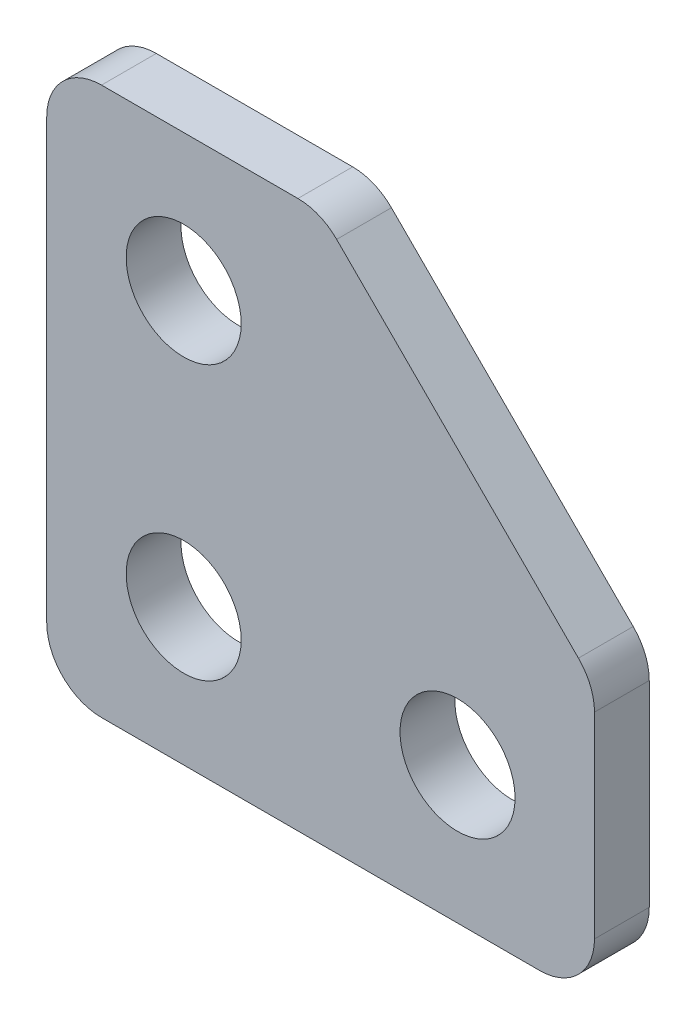
ISO-10303-21;
HEADER;
FILE_DESCRIPTION(('STEP AP214'),'2;1');
FILE_NAME('part.step','',(''),(''),'','','');
FILE_SCHEMA(('AUTOMOTIVE_DESIGN { 1 0 10303 214 1 1 1 1 }'));
ENDSEC;
DATA;
#1=APPLICATION_CONTEXT('core data for automotive mechanical design processes');
#2=APPLICATION_PROTOCOL_DEFINITION('international standard','automotive_design',2000,#1);
#3=PRODUCT_CONTEXT('',#1,'mechanical');
#4=PRODUCT('Part','Part','',(#3));
#5=PRODUCT_RELATED_PRODUCT_CATEGORY('part','',(#4));
#6=PRODUCT_DEFINITION_FORMATION('','',#4);
#7=PRODUCT_DEFINITION_CONTEXT('part definition',#1,'design');
#8=PRODUCT_DEFINITION('design','',#6,#7);
#9=PRODUCT_DEFINITION_SHAPE('','',#8);
#10=(LENGTH_UNIT() NAMED_UNIT(*) SI_UNIT(.MILLI.,.METRE.));
#11=(NAMED_UNIT(*) PLANE_ANGLE_UNIT() SI_UNIT($,.RADIAN.));
#12=(NAMED_UNIT(*) SI_UNIT($,.STERADIAN.) SOLID_ANGLE_UNIT());
#13=UNCERTAINTY_MEASURE_WITH_UNIT(LENGTH_MEASURE(1.E-05),#10,'distance_accuracy_value','');
#14=(GEOMETRIC_REPRESENTATION_CONTEXT(3) GLOBAL_UNCERTAINTY_ASSIGNED_CONTEXT((#13)) GLOBAL_UNIT_ASSIGNED_CONTEXT((#10,
#11,#12)) REPRESENTATION_CONTEXT('',''));
#15=CARTESIAN_POINT('',(0.,0.,0.));
#16=DIRECTION('',(0.,0.,1.));
#17=DIRECTION('',(1.,0.,0.));
#18=AXIS2_PLACEMENT_3D('',#15,#16,#17);
#19=CARTESIAN_POINT('',(0.,-5.,2.));
#20=DIRECTION('',(0.,1.,0.));
#21=DIRECTION('',(0.,0.,1.));
#22=AXIS2_PLACEMENT_3D('',#19,#20,#21);
#23=PLANE('',#22);
#24=DIRECTION('',(1.,0.,0.));
#25=VECTOR('',#24,1.);
#26=CARTESIAN_POINT('',(0.,-5.,2.));
#27=LINE('',#26,#25);
#28=CARTESIAN_POINT('',(-3.,-5.,2.));
#29=VERTEX_POINT('',#28);
#30=CARTESIAN_POINT('',(13.,-5.,2.));
#31=VERTEX_POINT('',#30);
#32=EDGE_CURVE('E136',#29,#31,#27,.T.);
#33=ORIENTED_EDGE('',*,*,#32,.F.);
#34=DIRECTION('',(0.,0.,-1.));
#35=VECTOR('',#34,1.);
#36=CARTESIAN_POINT('',(-3.,-5.,2.));
#37=LINE('',#36,#35);
#38=CARTESIAN_POINT('',(-3.,-5.,0.));
#39=VERTEX_POINT('',#38);
#40=EDGE_CURVE('E121',#29,#39,#37,.T.);
#41=ORIENTED_EDGE('',*,*,#40,.T.);
#42=DIRECTION('',(1.,0.,0.));
#43=VECTOR('',#42,1.);
#44=CARTESIAN_POINT('',(0.,-5.,0.));
#45=LINE('',#44,#43);
#46=CARTESIAN_POINT('',(13.,-5.,0.));
#47=VERTEX_POINT('',#46);
#48=EDGE_CURVE('E133',#39,#47,#45,.T.);
#49=ORIENTED_EDGE('',*,*,#48,.T.);
#50=DIRECTION('',(0.,0.,-1.));
#51=VECTOR('',#50,1.);
#52=CARTESIAN_POINT('',(13.,-5.,2.));
#53=LINE('',#52,#51);
#54=EDGE_CURVE('E138',#47,#31,#53,.F.);
#55=ORIENTED_EDGE('',*,*,#54,.T.);
#56=EDGE_LOOP('',(#33,#41,#49,#55));
#57=FACE_BOUND('',#56,.T.);
#58=ADVANCED_FACE('F39',(#57),#23,.F.);
#59=CARTESIAN_POINT('',(15.,0.,2.));
#60=DIRECTION('',(1.,0.,0.));
#61=DIRECTION('',(0.,0.,-1.));
#62=AXIS2_PLACEMENT_3D('',#59,#60,#61);
#63=PLANE('',#62);
#64=DIRECTION('',(0.,-1.,0.));
#65=VECTOR('',#64,1.);
#66=CARTESIAN_POINT('',(15.,0.,2.));
#67=LINE('',#66,#65);
#68=CARTESIAN_POINT('',(15.,4.17157287525381,2.));
#69=VERTEX_POINT('',#68);
#70=CARTESIAN_POINT('',(15.,-3.,2.));
#71=VERTEX_POINT('',#70);
#72=EDGE_CURVE('E266',#69,#71,#67,.T.);
#73=ORIENTED_EDGE('',*,*,#72,.T.);
#74=DIRECTION('',(0.,0.,-1.));
#75=VECTOR('',#74,1.);
#76=CARTESIAN_POINT('',(15.,-3.,0.));
#77=LINE('',#76,#75);
#78=CARTESIAN_POINT('',(15.,-3.,0.));
#79=VERTEX_POINT('',#78);
#80=EDGE_CURVE('E275',#71,#79,#77,.T.);
#81=ORIENTED_EDGE('',*,*,#80,.T.);
#82=DIRECTION('',(0.,-1.,0.));
#83=VECTOR('',#82,1.);
#84=CARTESIAN_POINT('',(15.,0.,0.));
#85=LINE('',#84,#83);
#86=CARTESIAN_POINT('',(15.,4.17157287525381,0.));
#87=VERTEX_POINT('',#86);
#88=EDGE_CURVE('E143',#87,#79,#85,.T.);
#89=ORIENTED_EDGE('',*,*,#88,.F.);
#90=DIRECTION('',(0.,0.,-1.));
#91=VECTOR('',#90,1.);
#92=CARTESIAN_POINT('',(15.,4.17157287525381,2.));
#93=LINE('',#92,#91);
#94=EDGE_CURVE('E274',#87,#69,#93,.F.);
#95=ORIENTED_EDGE('',*,*,#94,.T.);
#96=EDGE_LOOP('',(#73,#81,#89,#95));
#97=FACE_BOUND('',#96,.T.);
#98=ADVANCED_FACE('F218',(#97),#63,.T.);
#99=CARTESIAN_POINT('',(10.,10.,2.));
#100=DIRECTION('',(0.707106781186547,0.707106781186547,0.));
#101=DIRECTION('',(-0.707106781186548,0.707106781186548,0.));
#102=AXIS2_PLACEMENT_3D('',#99,#100,#101);
#103=PLANE('',#102);
#104=DIRECTION('',(0.707106781186548,-0.707106781186548,0.));
#105=VECTOR('',#104,1.);
#106=CARTESIAN_POINT('',(10.,10.,2.));
#107=LINE('',#106,#105);
#108=CARTESIAN_POINT('',(5.5857864376269,14.4142135623731,2.));
#109=VERTEX_POINT('',#108);
#110=CARTESIAN_POINT('',(14.4142135623731,5.5857864376269,2.));
#111=VERTEX_POINT('',#110);
#112=EDGE_CURVE('E263',#109,#111,#107,.T.);
#113=ORIENTED_EDGE('',*,*,#112,.T.);
#114=DIRECTION('',(0.,0.,-1.));
#115=VECTOR('',#114,1.);
#116=CARTESIAN_POINT('',(14.4142135623731,5.5857864376269,2.));
#117=LINE('',#116,#115);
#118=CARTESIAN_POINT('',(14.4142135623731,5.5857864376269,0.));
#119=VERTEX_POINT('',#118);
#120=EDGE_CURVE('E289',#111,#119,#117,.T.);
#121=ORIENTED_EDGE('',*,*,#120,.T.);
#122=DIRECTION('',(0.707106781186548,-0.707106781186548,0.));
#123=VECTOR('',#122,1.);
#124=CARTESIAN_POINT('',(10.,10.,0.));
#125=LINE('',#124,#123);
#126=CARTESIAN_POINT('',(5.5857864376269,14.4142135623731,0.));
#127=VERTEX_POINT('',#126);
#128=EDGE_CURVE('E145',#127,#119,#125,.T.);
#129=ORIENTED_EDGE('',*,*,#128,.F.);
#130=DIRECTION('',(0.,0.,-1.));
#131=VECTOR('',#130,1.);
#132=CARTESIAN_POINT('',(5.5857864376269,14.4142135623731,2.));
#133=LINE('',#132,#131);
#134=EDGE_CURVE('E246',#127,#109,#133,.F.);
#135=ORIENTED_EDGE('',*,*,#134,.T.);
#136=EDGE_LOOP('',(#113,#121,#129,#135));
#137=FACE_BOUND('',#136,.T.);
#138=ADVANCED_FACE('F223',(#137),#103,.T.);
#139=CARTESIAN_POINT('',(0.,15.,2.));
#140=DIRECTION('',(0.,1.,0.));
#141=DIRECTION('',(0.,0.,1.));
#142=AXIS2_PLACEMENT_3D('',#139,#140,#141);
#143=PLANE('',#142);
#144=DIRECTION('',(1.,0.,0.));
#145=VECTOR('',#144,1.);
#146=CARTESIAN_POINT('',(0.,15.,2.));
#147=LINE('',#146,#145);
#148=CARTESIAN_POINT('',(-3.,15.,2.));
#149=VERTEX_POINT('',#148);
#150=CARTESIAN_POINT('',(4.17157287525381,15.,2.));
#151=VERTEX_POINT('',#150);
#152=EDGE_CURVE('E265',#149,#151,#147,.T.);
#153=ORIENTED_EDGE('',*,*,#152,.T.);
#154=DIRECTION('',(0.,0.,-1.));
#155=VECTOR('',#154,1.);
#156=CARTESIAN_POINT('',(4.17157287525381,15.,2.));
#157=LINE('',#156,#155);
#158=CARTESIAN_POINT('',(4.17157287525381,15.,0.));
#159=VERTEX_POINT('',#158);
#160=EDGE_CURVE('E12',#151,#159,#157,.T.);
#161=ORIENTED_EDGE('',*,*,#160,.T.);
#162=DIRECTION('',(1.,0.,0.));
#163=VECTOR('',#162,1.);
#164=CARTESIAN_POINT('',(0.,15.,0.));
#165=LINE('',#164,#163);
#166=CARTESIAN_POINT('',(-3.,15.,0.));
#167=VERTEX_POINT('',#166);
#168=EDGE_CURVE('E153',#167,#159,#165,.T.);
#169=ORIENTED_EDGE('',*,*,#168,.F.);
#170=DIRECTION('',(0.,0.,-1.));
#171=VECTOR('',#170,1.);
#172=CARTESIAN_POINT('',(-3.,15.,2.));
#173=LINE('',#172,#171);
#174=EDGE_CURVE('E47',#167,#149,#173,.F.);
#175=ORIENTED_EDGE('',*,*,#174,.T.);
#176=EDGE_LOOP('',(#153,#161,#169,#175));
#177=FACE_BOUND('',#176,.T.);
#178=ADVANCED_FACE('F296',(#177),#143,.T.);
#179=CARTESIAN_POINT('',(0.,0.,2.));
#180=DIRECTION('',(0.,0.,-1.));
#181=DIRECTION('',(-1.,0.,0.));
#182=AXIS2_PLACEMENT_3D('',#179,#180,#181);
#183=CYLINDRICAL_SURFACE('',#182,2.1);
#184=CARTESIAN_POINT('',(0.,0.,2.));
#185=DIRECTION('',(0.,0.,1.));
#186=DIRECTION('',(1.,0.,0.));
#187=AXIS2_PLACEMENT_3D('',#184,#185,#186);
#188=CIRCLE('',#187,2.1);
#189=CARTESIAN_POINT('',(2.1,0.,2.));
#190=VERTEX_POINT('',#189);
#191=EDGE_CURVE('E192',#190,#190,#188,.T.);
#192=ORIENTED_EDGE('',*,*,#191,.T.);
#193=EDGE_LOOP('',(#192));
#194=FACE_BOUND('',#193,.T.);
#195=CARTESIAN_POINT('',(0.,0.,0.));
#196=DIRECTION('',(0.,0.,1.));
#197=DIRECTION('',(1.,0.,0.));
#198=AXIS2_PLACEMENT_3D('',#195,#196,#197);
#199=CIRCLE('',#198,2.1);
#200=CARTESIAN_POINT('',(2.1,0.,0.));
#201=VERTEX_POINT('',#200);
#202=EDGE_CURVE('E161',#201,#201,#199,.T.);
#203=ORIENTED_EDGE('',*,*,#202,.F.);
#204=EDGE_LOOP('',(#203));
#205=FACE_BOUND('',#204,.T.);
#206=ADVANCED_FACE('F303',(#194,#205),#183,.F.);
#207=CARTESIAN_POINT('',(0.,10.,2.));
#208=DIRECTION('',(0.,0.,-1.));
#209=DIRECTION('',(-1.,0.,0.));
#210=AXIS2_PLACEMENT_3D('',#207,#208,#209);
#211=CYLINDRICAL_SURFACE('',#210,2.1);
#212=CARTESIAN_POINT('',(0.,10.,2.));
#213=DIRECTION('',(0.,0.,1.));
#214=DIRECTION('',(1.,0.,0.));
#215=AXIS2_PLACEMENT_3D('',#212,#213,#214);
#216=CIRCLE('',#215,2.1);
#217=CARTESIAN_POINT('',(2.1,10.,2.));
#218=VERTEX_POINT('',#217);
#219=EDGE_CURVE('E188',#218,#218,#216,.T.);
#220=ORIENTED_EDGE('',*,*,#219,.T.);
#221=EDGE_LOOP('',(#220));
#222=FACE_BOUND('',#221,.T.);
#223=CARTESIAN_POINT('',(0.,10.,0.));
#224=DIRECTION('',(0.,0.,1.));
#225=DIRECTION('',(1.,0.,0.));
#226=AXIS2_PLACEMENT_3D('',#223,#224,#225);
#227=CIRCLE('',#226,2.1);
#228=CARTESIAN_POINT('',(2.1,10.,0.));
#229=VERTEX_POINT('',#228);
#230=EDGE_CURVE('E158',#229,#229,#227,.T.);
#231=ORIENTED_EDGE('',*,*,#230,.F.);
#232=EDGE_LOOP('',(#231));
#233=FACE_BOUND('',#232,.T.);
#234=ADVANCED_FACE('F298',(#222,#233),#211,.F.);
#235=CARTESIAN_POINT('',(-5.,0.,2.));
#236=DIRECTION('',(1.,0.,0.));
#237=DIRECTION('',(0.,1.,0.));
#238=AXIS2_PLACEMENT_3D('',#235,#236,#237);
#239=PLANE('',#238);
#240=DIRECTION('',(0.,-1.,0.));
#241=VECTOR('',#240,1.);
#242=CARTESIAN_POINT('',(-5.,0.,0.));
#243=LINE('',#242,#241);
#244=CARTESIAN_POINT('',(-5.,13.,0.));
#245=VERTEX_POINT('',#244);
#246=CARTESIAN_POINT('',(-5.,-3.,0.));
#247=VERTEX_POINT('',#246);
#248=EDGE_CURVE('E156',#245,#247,#243,.T.);
#249=ORIENTED_EDGE('',*,*,#248,.T.);
#250=DIRECTION('',(0.,0.,-1.));
#251=VECTOR('',#250,1.);
#252=CARTESIAN_POINT('',(-5.,-3.,2.));
#253=LINE('',#252,#251);
#254=CARTESIAN_POINT('',(-5.,-3.,2.));
#255=VERTEX_POINT('',#254);
#256=EDGE_CURVE('E122',#247,#255,#253,.F.);
#257=ORIENTED_EDGE('',*,*,#256,.T.);
#258=DIRECTION('',(0.,-1.,0.));
#259=VECTOR('',#258,1.);
#260=CARTESIAN_POINT('',(-5.,0.,2.));
#261=LINE('',#260,#259);
#262=CARTESIAN_POINT('',(-5.,13.,2.));
#263=VERTEX_POINT('',#262);
#264=EDGE_CURVE('E193',#263,#255,#261,.T.);
#265=ORIENTED_EDGE('',*,*,#264,.F.);
#266=DIRECTION('',(0.,0.,-1.));
#267=VECTOR('',#266,1.);
#268=CARTESIAN_POINT('',(-5.,13.,0.));
#269=LINE('',#268,#267);
#270=EDGE_CURVE('E127',#263,#245,#269,.T.);
#271=ORIENTED_EDGE('',*,*,#270,.T.);
#272=EDGE_LOOP('',(#249,#257,#265,#271));
#273=FACE_BOUND('',#272,.T.);
#274=ADVANCED_FACE('F213',(#273),#239,.F.);
#275=CARTESIAN_POINT('',(10.,0.,2.));
#276=DIRECTION('',(0.,0.,-1.));
#277=DIRECTION('',(-1.,0.,0.));
#278=AXIS2_PLACEMENT_3D('',#275,#276,#277);
#279=CYLINDRICAL_SURFACE('',#278,2.1);
#280=CARTESIAN_POINT('',(10.,0.,2.));
#281=DIRECTION('',(0.,0.,1.));
#282=DIRECTION('',(1.,0.,0.));
#283=AXIS2_PLACEMENT_3D('',#280,#281,#282);
#284=CIRCLE('',#283,2.1);
#285=CARTESIAN_POINT('',(12.1,0.,2.));
#286=VERTEX_POINT('',#285);
#287=EDGE_CURVE('E147',#286,#286,#284,.T.);
#288=ORIENTED_EDGE('',*,*,#287,.T.);
#289=EDGE_LOOP('',(#288));
#290=FACE_BOUND('',#289,.T.);
#291=CARTESIAN_POINT('',(10.,0.,0.));
#292=DIRECTION('',(0.,0.,1.));
#293=DIRECTION('',(1.,0.,0.));
#294=AXIS2_PLACEMENT_3D('',#291,#292,#293);
#295=CIRCLE('',#294,2.1);
#296=CARTESIAN_POINT('',(12.1,0.,0.));
#297=VERTEX_POINT('',#296);
#298=EDGE_CURVE('E164',#297,#297,#295,.T.);
#299=ORIENTED_EDGE('',*,*,#298,.F.);
#300=EDGE_LOOP('',(#299));
#301=FACE_BOUND('',#300,.T.);
#302=ADVANCED_FACE('F202',(#290,#301),#279,.F.);
#303=CARTESIAN_POINT('',(0.,0.,2.));
#304=DIRECTION('',(0.,0.,1.));
#305=DIRECTION('',(1.,0.,0.));
#306=AXIS2_PLACEMENT_3D('',#303,#304,#305);
#307=PLANE('',#306);
#308=ORIENTED_EDGE('',*,*,#264,.T.);
#309=CARTESIAN_POINT('',(-3.,-3.,2.));
#310=DIRECTION('',(0.,0.,1.));
#311=DIRECTION('',(1.,0.,0.));
#312=AXIS2_PLACEMENT_3D('',#309,#310,#311);
#313=CIRCLE('',#312,2.);
#314=EDGE_CURVE('E252',#255,#29,#313,.T.);
#315=ORIENTED_EDGE('',*,*,#314,.T.);
#316=ORIENTED_EDGE('',*,*,#32,.T.);
#317=CARTESIAN_POINT('',(13.,-3.,2.));
#318=DIRECTION('',(0.,0.,1.));
#319=DIRECTION('',(1.,0.,0.));
#320=AXIS2_PLACEMENT_3D('',#317,#318,#319);
#321=CIRCLE('',#320,2.);
#322=EDGE_CURVE('E248',#31,#71,#321,.T.);
#323=ORIENTED_EDGE('',*,*,#322,.T.);
#324=ORIENTED_EDGE('',*,*,#72,.F.);
#325=CARTESIAN_POINT('',(13.,4.17157287525381,2.));
#326=DIRECTION('',(0.,0.,1.));
#327=DIRECTION('',(1.,0.,0.));
#328=AXIS2_PLACEMENT_3D('',#325,#326,#327);
#329=CIRCLE('',#328,2.);
#330=EDGE_CURVE('E247',#69,#111,#329,.T.);
#331=ORIENTED_EDGE('',*,*,#330,.T.);
#332=ORIENTED_EDGE('',*,*,#112,.F.);
#333=CARTESIAN_POINT('',(4.17157287525381,13.,2.));
#334=DIRECTION('',(0.,0.,1.));
#335=DIRECTION('',(1.,0.,0.));
#336=AXIS2_PLACEMENT_3D('',#333,#334,#335);
#337=CIRCLE('',#336,2.);
#338=EDGE_CURVE('E54',#109,#151,#337,.T.);
#339=ORIENTED_EDGE('',*,*,#338,.T.);
#340=ORIENTED_EDGE('',*,*,#152,.F.);
#341=CARTESIAN_POINT('',(-3.,13.,2.));
#342=DIRECTION('',(0.,0.,1.));
#343=DIRECTION('',(1.,0.,0.));
#344=AXIS2_PLACEMENT_3D('',#341,#342,#343);
#345=CIRCLE('',#344,2.);
#346=EDGE_CURVE('E177',#149,#263,#345,.T.);
#347=ORIENTED_EDGE('',*,*,#346,.T.);
#348=EDGE_LOOP('',(#308,#315,#316,#323,#324,#331,#332,#339,#340,#347));
#349=FACE_BOUND('',#348,.T.);
#350=ORIENTED_EDGE('',*,*,#219,.F.);
#351=EDGE_LOOP('',(#350));
#352=FACE_BOUND('',#351,.T.);
#353=ORIENTED_EDGE('',*,*,#191,.F.);
#354=EDGE_LOOP('',(#353));
#355=FACE_BOUND('',#354,.T.);
#356=ORIENTED_EDGE('',*,*,#287,.F.);
#357=EDGE_LOOP('',(#356));
#358=FACE_BOUND('',#357,.T.);
#359=ADVANCED_FACE('F205',(#349,#352,#355,#358),#307,.T.);
#360=CARTESIAN_POINT('',(0.,0.,0.));
#361=DIRECTION('',(0.,0.,1.));
#362=DIRECTION('',(1.,0.,0.));
#363=AXIS2_PLACEMENT_3D('',#360,#361,#362);
#364=PLANE('',#363);
#365=ORIENTED_EDGE('',*,*,#48,.F.);
#366=CARTESIAN_POINT('',(-3.,-3.,0.));
#367=DIRECTION('',(0.,0.,1.));
#368=DIRECTION('',(1.,0.,0.));
#369=AXIS2_PLACEMENT_3D('',#366,#367,#368);
#370=CIRCLE('',#369,2.);
#371=EDGE_CURVE('E117',#39,#247,#370,.F.);
#372=ORIENTED_EDGE('',*,*,#371,.T.);
#373=ORIENTED_EDGE('',*,*,#248,.F.);
#374=CARTESIAN_POINT('',(-3.,13.,0.));
#375=DIRECTION('',(0.,0.,1.));
#376=DIRECTION('',(1.,0.,0.));
#377=AXIS2_PLACEMENT_3D('',#374,#375,#376);
#378=CIRCLE('',#377,2.);
#379=EDGE_CURVE('E137',#245,#167,#378,.F.);
#380=ORIENTED_EDGE('',*,*,#379,.T.);
#381=ORIENTED_EDGE('',*,*,#168,.T.);
#382=CARTESIAN_POINT('',(4.17157287525381,13.,0.));
#383=DIRECTION('',(0.,0.,1.));
#384=DIRECTION('',(1.,0.,0.));
#385=AXIS2_PLACEMENT_3D('',#382,#383,#384);
#386=CIRCLE('',#385,2.);
#387=EDGE_CURVE('E169',#159,#127,#386,.F.);
#388=ORIENTED_EDGE('',*,*,#387,.T.);
#389=ORIENTED_EDGE('',*,*,#128,.T.);
#390=CARTESIAN_POINT('',(13.,4.17157287525381,0.));
#391=DIRECTION('',(0.,0.,1.));
#392=DIRECTION('',(1.,0.,0.));
#393=AXIS2_PLACEMENT_3D('',#390,#391,#392);
#394=CIRCLE('',#393,2.);
#395=EDGE_CURVE('E171',#119,#87,#394,.F.);
#396=ORIENTED_EDGE('',*,*,#395,.T.);
#397=ORIENTED_EDGE('',*,*,#88,.T.);
#398=CARTESIAN_POINT('',(13.,-3.,0.));
#399=DIRECTION('',(0.,0.,1.));
#400=DIRECTION('',(1.,0.,0.));
#401=AXIS2_PLACEMENT_3D('',#398,#399,#400);
#402=CIRCLE('',#401,2.);
#403=EDGE_CURVE('E128',#79,#47,#402,.F.);
#404=ORIENTED_EDGE('',*,*,#403,.T.);
#405=EDGE_LOOP('',(#365,#372,#373,#380,#381,#388,#389,#396,#397,#404));
#406=FACE_BOUND('',#405,.T.);
#407=ORIENTED_EDGE('',*,*,#230,.T.);
#408=EDGE_LOOP('',(#407));
#409=FACE_BOUND('',#408,.T.);
#410=ORIENTED_EDGE('',*,*,#202,.T.);
#411=EDGE_LOOP('',(#410));
#412=FACE_BOUND('',#411,.T.);
#413=ORIENTED_EDGE('',*,*,#298,.T.);
#414=EDGE_LOOP('',(#413));
#415=FACE_BOUND('',#414,.T.);
#416=ADVANCED_FACE('F140',(#406,#409,#412,#415),#364,.F.);
#417=CARTESIAN_POINT('',(-3.,-3.,2.));
#418=DIRECTION('',(0.,0.,-1.));
#419=DIRECTION('',(-1.,0.,0.));
#420=AXIS2_PLACEMENT_3D('',#417,#418,#419);
#421=CYLINDRICAL_SURFACE('',#420,2.);
#422=ORIENTED_EDGE('',*,*,#314,.F.);
#423=ORIENTED_EDGE('',*,*,#256,.F.);
#424=ORIENTED_EDGE('',*,*,#371,.F.);
#425=ORIENTED_EDGE('',*,*,#40,.F.);
#426=EDGE_LOOP('',(#422,#423,#424,#425));
#427=FACE_BOUND('',#426,.T.);
#428=ADVANCED_FACE('F120',(#427),#421,.T.);
#429=CARTESIAN_POINT('',(13.,-3.,2.));
#430=DIRECTION('',(0.,0.,1.));
#431=DIRECTION('',(1.,0.,0.));
#432=AXIS2_PLACEMENT_3D('',#429,#430,#431);
#433=CYLINDRICAL_SURFACE('',#432,2.);
#434=ORIENTED_EDGE('',*,*,#322,.F.);
#435=ORIENTED_EDGE('',*,*,#54,.F.);
#436=ORIENTED_EDGE('',*,*,#403,.F.);
#437=ORIENTED_EDGE('',*,*,#80,.F.);
#438=EDGE_LOOP('',(#434,#435,#436,#437));
#439=FACE_BOUND('',#438,.T.);
#440=ADVANCED_FACE('F230',(#439),#433,.T.);
#441=CARTESIAN_POINT('',(13.,4.17157287525381,2.));
#442=DIRECTION('',(0.,0.,-1.));
#443=DIRECTION('',(-1.,0.,0.));
#444=AXIS2_PLACEMENT_3D('',#441,#442,#443);
#445=CYLINDRICAL_SURFACE('',#444,2.);
#446=ORIENTED_EDGE('',*,*,#330,.F.);
#447=ORIENTED_EDGE('',*,*,#94,.F.);
#448=ORIENTED_EDGE('',*,*,#395,.F.);
#449=ORIENTED_EDGE('',*,*,#120,.F.);
#450=EDGE_LOOP('',(#446,#447,#448,#449));
#451=FACE_BOUND('',#450,.T.);
#452=ADVANCED_FACE('F233',(#451),#445,.T.);
#453=CARTESIAN_POINT('',(4.17157287525381,13.,2.));
#454=DIRECTION('',(0.,0.,-1.));
#455=DIRECTION('',(-1.,0.,0.));
#456=AXIS2_PLACEMENT_3D('',#453,#454,#455);
#457=CYLINDRICAL_SURFACE('',#456,2.);
#458=ORIENTED_EDGE('',*,*,#338,.F.);
#459=ORIENTED_EDGE('',*,*,#134,.F.);
#460=ORIENTED_EDGE('',*,*,#387,.F.);
#461=ORIENTED_EDGE('',*,*,#160,.F.);
#462=EDGE_LOOP('',(#458,#459,#460,#461));
#463=FACE_BOUND('',#462,.T.);
#464=ADVANCED_FACE('F236',(#463),#457,.T.);
#465=CARTESIAN_POINT('',(-3.,13.,2.));
#466=DIRECTION('',(0.,0.,1.));
#467=DIRECTION('',(1.,0.,0.));
#468=AXIS2_PLACEMENT_3D('',#465,#466,#467);
#469=CYLINDRICAL_SURFACE('',#468,2.);
#470=ORIENTED_EDGE('',*,*,#346,.F.);
#471=ORIENTED_EDGE('',*,*,#174,.F.);
#472=ORIENTED_EDGE('',*,*,#379,.F.);
#473=ORIENTED_EDGE('',*,*,#270,.F.);
#474=EDGE_LOOP('',(#470,#471,#472,#473));
#475=FACE_BOUND('',#474,.T.);
#476=ADVANCED_FACE('F41',(#475),#469,.T.);
#477=CLOSED_SHELL('',(#58,#98,#138,#178,#206,#234,#274,#302,#359,#416,#428,#440,#452,#464,#476));
#478=MANIFOLD_SOLID_BREP('B2',#477);
#479=ADVANCED_BREP_SHAPE_REPRESENTATION('',(#18,#478),#14);
#480=SHAPE_DEFINITION_REPRESENTATION(#9,#479);
ENDSEC;
END-ISO-10303-21;
